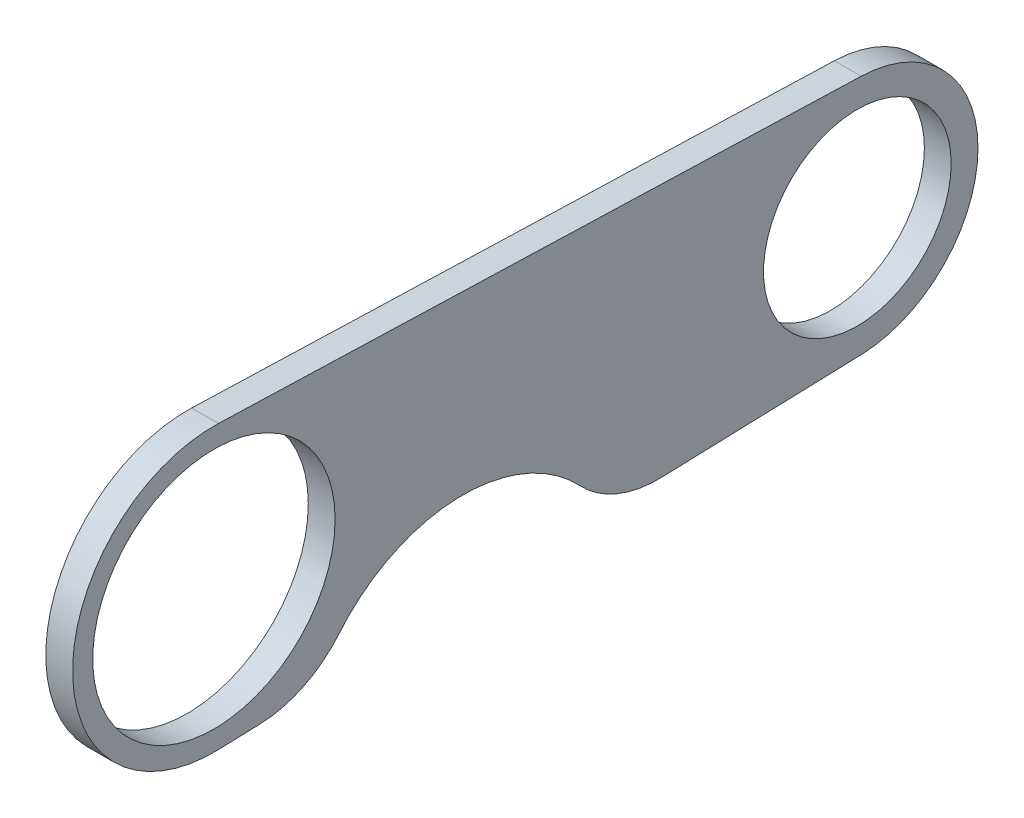
ISO-10303-21;
HEADER;
FILE_DESCRIPTION(('STEP AP214'),'2;1');
FILE_NAME('part.step','',(''),(''),'','','');
FILE_SCHEMA(('AUTOMOTIVE_DESIGN { 1 0 10303 214 1 1 1 1 }'));
ENDSEC;
DATA;
#1=APPLICATION_CONTEXT('core data for automotive mechanical design processes');
#2=APPLICATION_PROTOCOL_DEFINITION('international standard','automotive_design',2000,#1);
#3=PRODUCT_CONTEXT('',#1,'mechanical');
#4=PRODUCT('Part','Part','',(#3));
#5=PRODUCT_RELATED_PRODUCT_CATEGORY('part','',(#4));
#6=PRODUCT_DEFINITION_FORMATION('','',#4);
#7=PRODUCT_DEFINITION_CONTEXT('part definition',#1,'design');
#8=PRODUCT_DEFINITION('design','',#6,#7);
#9=PRODUCT_DEFINITION_SHAPE('','',#8);
#10=(LENGTH_UNIT() NAMED_UNIT(*) SI_UNIT(.MILLI.,.METRE.));
#11=(NAMED_UNIT(*) PLANE_ANGLE_UNIT() SI_UNIT($,.RADIAN.));
#12=(NAMED_UNIT(*) SI_UNIT($,.STERADIAN.) SOLID_ANGLE_UNIT());
#13=UNCERTAINTY_MEASURE_WITH_UNIT(LENGTH_MEASURE(1.E-05),#10,'distance_accuracy_value','');
#14=(GEOMETRIC_REPRESENTATION_CONTEXT(3) GLOBAL_UNCERTAINTY_ASSIGNED_CONTEXT((#13)) GLOBAL_UNIT_ASSIGNED_CONTEXT((#10,
#11,#12)) REPRESENTATION_CONTEXT('',''));
#15=CARTESIAN_POINT('',(0.,0.,0.));
#16=DIRECTION('',(0.,0.,1.));
#17=DIRECTION('',(1.,0.,0.));
#18=AXIS2_PLACEMENT_3D('',#15,#16,#17);
#19=CARTESIAN_POINT('',(3.175,-16.7236361933633,37.5631736458333));
#20=DIRECTION('',(0.,0.999485197350227,0.0320833333333336));
#21=DIRECTION('',(0.,-0.0320833333333336,0.999485197350227));
#22=AXIS2_PLACEMENT_3D('',#19,#20,#21);
#23=PLANE('',#22);
#24=DIRECTION('',(0.,0.0320833333333336,-0.999485197350227));
#25=VECTOR('',#24,1.);
#26=CARTESIAN_POINT('',(0.,-16.7236361933633,37.5631736458333));
#27=LINE('',#26,#25);
#28=CARTESIAN_POINT('',(0.,-16.7236361933633,37.5631736458333));
#29=VERTEX_POINT('',#28);
#30=CARTESIAN_POINT('',(0.,-16.5661067651328,32.6556931784006));
#31=VERTEX_POINT('',#30);
#32=EDGE_CURVE('E187',#29,#31,#27,.T.);
#33=ORIENTED_EDGE('',*,*,#32,.T.);
#34=DIRECTION('',(1.,0.,0.));
#35=VECTOR('',#34,1.);
#36=CARTESIAN_POINT('',(3.175,-16.5661067651328,32.6556931784006));
#37=LINE('',#36,#35);
#38=CARTESIAN_POINT('',(3.175,-16.5661067651328,32.6556931784006));
#39=VERTEX_POINT('',#38);
#40=EDGE_CURVE('E11',#31,#39,#37,.T.);
#41=ORIENTED_EDGE('',*,*,#40,.T.);
#42=DIRECTION('',(0.,0.0320833333333336,-0.999485197350227));
#43=VECTOR('',#42,1.);
#44=CARTESIAN_POINT('',(3.175,-16.7236361933633,37.5631736458333));
#45=LINE('',#44,#43);
#46=CARTESIAN_POINT('',(3.175,-16.7236361933633,37.5631736458333));
#47=VERTEX_POINT('',#46);
#48=EDGE_CURVE('E104',#47,#39,#45,.T.);
#49=ORIENTED_EDGE('',*,*,#48,.F.);
#50=DIRECTION('',(-1.,0.,0.));
#51=VECTOR('',#50,1.);
#52=CARTESIAN_POINT('',(3.175,-16.7236361933633,37.5631736458333));
#53=LINE('',#52,#51);
#54=EDGE_CURVE('E108',#47,#29,#53,.T.);
#55=ORIENTED_EDGE('',*,*,#54,.T.);
#56=EDGE_LOOP('',(#33,#41,#49,#55));
#57=FACE_BOUND('',#56,.T.);
#58=ADVANCED_FACE('F40',(#57),#23,.F.);
#59=CARTESIAN_POINT('',(3.175,0.,38.1));
#60=DIRECTION('',(1.,0.,0.));
#61=DIRECTION('',(0.,0.,-1.));
#62=AXIS2_PLACEMENT_3D('',#59,#60,#61);
#63=PLANE('',#62);
#64=CARTESIAN_POINT('',(3.175,-24.13,8.61520561374049));
#65=DIRECTION('',(1.,0.,0.));
#66=DIRECTION('',(0.,0.,-1.));
#67=AXIS2_PLACEMENT_3D('',#64,#65,#66);
#68=CIRCLE('',#67,19.05);
#69=CARTESIAN_POINT('',(3.175,-11.0598475480956,-5.24385694055871));
#70=VERTEX_POINT('',#69);
#71=CARTESIAN_POINT('',(3.175,-11.9755868552709,23.2839731525366));
#72=VERTEX_POINT('',#71);
#73=EDGE_CURVE('E148',#70,#72,#68,.T.);
#74=ORIENTED_EDGE('',*,*,#73,.F.);
#75=CARTESIAN_POINT('',(3.175,-2.34641258015939,-14.4832319767582));
#76=DIRECTION('',(1.,0.,0.));
#77=DIRECTION('',(0.,0.,-1.));
#78=AXIS2_PLACEMENT_3D('',#75,#76,#77);
#79=CIRCLE('',#78,12.7);
#80=CARTESIAN_POINT('',(3.175,-15.0398745865073,-14.8906903100915));
#81=VERTEX_POINT('',#80);
#82=EDGE_CURVE('E48',#70,#81,#79,.T.);
#83=ORIENTED_EDGE('',*,*,#82,.T.);
#84=CARTESIAN_POINT('',(3.175,-14.2801447571413,-38.558390625));
#85=VERTEX_POINT('',#84);
#86=EDGE_CURVE('E111',#81,#85,#45,.T.);
#87=ORIENTED_EDGE('',*,*,#86,.T.);
#88=CARTESIAN_POINT('',(3.175,0.,-38.1));
#89=DIRECTION('',(1.,0.,0.));
#90=DIRECTION('',(0.,0.,-1.));
#91=AXIS2_PLACEMENT_3D('',#88,#89,#90);
#92=CIRCLE('',#91,14.2875);
#93=CARTESIAN_POINT('',(3.175,14.2801447571414,-38.558390625));
#94=VERTEX_POINT('',#93);
#95=EDGE_CURVE('E110',#85,#94,#92,.T.);
#96=ORIENTED_EDGE('',*,*,#95,.T.);
#97=DIRECTION('',(0.,0.0320833333333331,0.999485197350227));
#98=VECTOR('',#97,1.);
#99=CARTESIAN_POINT('',(3.175,16.7236361933633,37.5631736458333));
#100=LINE('',#99,#98);
#101=CARTESIAN_POINT('',(3.175,16.7236361933633,37.5631736458333));
#102=VERTEX_POINT('',#101);
#103=EDGE_CURVE('E118',#94,#102,#100,.T.);
#104=ORIENTED_EDGE('',*,*,#103,.T.);
#105=CARTESIAN_POINT('',(3.175,0.,38.1));
#106=DIRECTION('',(1.,0.,0.));
#107=DIRECTION('',(0.,0.,-1.));
#108=AXIS2_PLACEMENT_3D('',#105,#106,#107);
#109=CIRCLE('',#108,16.73225);
#110=EDGE_CURVE('E114',#102,#47,#109,.T.);
#111=ORIENTED_EDGE('',*,*,#110,.T.);
#112=ORIENTED_EDGE('',*,*,#48,.T.);
#113=CARTESIAN_POINT('',(3.175,-3.87264475878492,33.063151511734));
#114=DIRECTION('',(1.,0.,0.));
#115=DIRECTION('',(0.,0.,-1.));
#116=AXIS2_PLACEMENT_3D('',#113,#114,#115);
#117=CIRCLE('',#116,12.7);
#118=EDGE_CURVE('E55',#39,#72,#117,.T.);
#119=ORIENTED_EDGE('',*,*,#118,.T.);
#120=EDGE_LOOP('',(#74,#83,#87,#96,#104,#111,#112,#119));
#121=FACE_BOUND('',#120,.T.);
#122=CARTESIAN_POINT('',(3.175,0.,38.1));
#123=DIRECTION('',(1.,0.,0.));
#124=DIRECTION('',(0.,0.,-1.));
#125=AXIS2_PLACEMENT_3D('',#122,#123,#124);
#126=CIRCLE('',#125,14.351);
#127=CARTESIAN_POINT('',(3.175,0.,23.749));
#128=VERTEX_POINT('',#127);
#129=EDGE_CURVE('E178',#128,#128,#126,.T.);
#130=ORIENTED_EDGE('',*,*,#129,.F.);
#131=EDGE_LOOP('',(#130));
#132=FACE_BOUND('',#131,.T.);
#133=CARTESIAN_POINT('',(3.175,0.,-38.1));
#134=DIRECTION('',(1.,0.,0.));
#135=DIRECTION('',(0.,0.,-1.));
#136=AXIS2_PLACEMENT_3D('',#133,#134,#135);
#137=CIRCLE('',#136,11.1125);
#138=CARTESIAN_POINT('',(3.175,0.,-49.2125));
#139=VERTEX_POINT('',#138);
#140=EDGE_CURVE('E171',#139,#139,#137,.T.);
#141=ORIENTED_EDGE('',*,*,#140,.F.);
#142=EDGE_LOOP('',(#141));
#143=FACE_BOUND('',#142,.T.);
#144=ADVANCED_FACE('F115',(#121,#132,#143),#63,.T.);
#145=CARTESIAN_POINT('',(0.,0.,38.1));
#146=DIRECTION('',(1.,0.,0.));
#147=DIRECTION('',(0.,0.,-1.));
#148=AXIS2_PLACEMENT_3D('',#145,#146,#147);
#149=PLANE('',#148);
#150=CARTESIAN_POINT('',(0.,-15.0398745865073,-14.8906903100915));
#151=VERTEX_POINT('',#150);
#152=CARTESIAN_POINT('',(0.,-14.2801447571413,-38.558390625));
#153=VERTEX_POINT('',#152);
#154=EDGE_CURVE('E165',#151,#153,#27,.T.);
#155=ORIENTED_EDGE('',*,*,#154,.F.);
#156=CARTESIAN_POINT('',(0.,-2.34641258015939,-14.4832319767582));
#157=DIRECTION('',(1.,0.,0.));
#158=DIRECTION('',(0.,0.,-1.));
#159=AXIS2_PLACEMENT_3D('',#156,#157,#158);
#160=CIRCLE('',#159,12.7);
#161=CARTESIAN_POINT('',(0.,-11.0598475480956,-5.24385694055871));
#162=VERTEX_POINT('',#161);
#163=EDGE_CURVE('E139',#151,#162,#160,.F.);
#164=ORIENTED_EDGE('',*,*,#163,.T.);
#165=CARTESIAN_POINT('',(0.,-24.13,8.61520561374049));
#166=DIRECTION('',(1.,0.,0.));
#167=DIRECTION('',(0.,0.,-1.));
#168=AXIS2_PLACEMENT_3D('',#165,#166,#167);
#169=CIRCLE('',#168,19.05);
#170=CARTESIAN_POINT('',(0.,-11.9755868552709,23.2839731525366));
#171=VERTEX_POINT('',#170);
#172=EDGE_CURVE('E162',#162,#171,#169,.T.);
#173=ORIENTED_EDGE('',*,*,#172,.T.);
#174=CARTESIAN_POINT('',(0.,-3.87264475878492,33.063151511734));
#175=DIRECTION('',(1.,0.,0.));
#176=DIRECTION('',(0.,0.,-1.));
#177=AXIS2_PLACEMENT_3D('',#174,#175,#176);
#178=CIRCLE('',#177,12.7);
#179=EDGE_CURVE('E131',#171,#31,#178,.F.);
#180=ORIENTED_EDGE('',*,*,#179,.T.);
#181=ORIENTED_EDGE('',*,*,#32,.F.);
#182=CARTESIAN_POINT('',(0.,0.,38.1));
#183=DIRECTION('',(1.,0.,0.));
#184=DIRECTION('',(0.,0.,-1.));
#185=AXIS2_PLACEMENT_3D('',#182,#183,#184);
#186=CIRCLE('',#185,16.73225);
#187=CARTESIAN_POINT('',(0.,16.7236361933633,37.5631736458333));
#188=VERTEX_POINT('',#187);
#189=EDGE_CURVE('E126',#188,#29,#186,.T.);
#190=ORIENTED_EDGE('',*,*,#189,.F.);
#191=DIRECTION('',(0.,0.0320833333333331,0.999485197350227));
#192=VECTOR('',#191,1.);
#193=CARTESIAN_POINT('',(0.,16.7236361933633,37.5631736458333));
#194=LINE('',#193,#192);
#195=CARTESIAN_POINT('',(0.,14.2801447571414,-38.558390625));
#196=VERTEX_POINT('',#195);
#197=EDGE_CURVE('E122',#196,#188,#194,.T.);
#198=ORIENTED_EDGE('',*,*,#197,.F.);
#199=CARTESIAN_POINT('',(0.,0.,-38.1));
#200=DIRECTION('',(1.,0.,0.));
#201=DIRECTION('',(0.,0.,-1.));
#202=AXIS2_PLACEMENT_3D('',#199,#200,#201);
#203=CIRCLE('',#202,14.2875);
#204=EDGE_CURVE('E189',#153,#196,#203,.T.);
#205=ORIENTED_EDGE('',*,*,#204,.F.);
#206=EDGE_LOOP('',(#155,#164,#173,#180,#181,#190,#198,#205));
#207=FACE_BOUND('',#206,.T.);
#208=CARTESIAN_POINT('',(0.,0.,38.1));
#209=DIRECTION('',(1.,0.,0.));
#210=DIRECTION('',(0.,0.,-1.));
#211=AXIS2_PLACEMENT_3D('',#208,#209,#210);
#212=CIRCLE('',#211,14.351);
#213=CARTESIAN_POINT('',(0.,0.,23.749));
#214=VERTEX_POINT('',#213);
#215=EDGE_CURVE('E176',#214,#214,#212,.T.);
#216=ORIENTED_EDGE('',*,*,#215,.T.);
#217=EDGE_LOOP('',(#216));
#218=FACE_BOUND('',#217,.T.);
#219=CARTESIAN_POINT('',(0.,0.,-38.1));
#220=DIRECTION('',(1.,0.,0.));
#221=DIRECTION('',(0.,0.,-1.));
#222=AXIS2_PLACEMENT_3D('',#219,#220,#221);
#223=CIRCLE('',#222,11.1125);
#224=CARTESIAN_POINT('',(0.,0.,-49.2125));
#225=VERTEX_POINT('',#224);
#226=EDGE_CURVE('E168',#225,#225,#223,.T.);
#227=ORIENTED_EDGE('',*,*,#226,.T.);
#228=EDGE_LOOP('',(#227));
#229=FACE_BOUND('',#228,.T.);
#230=ADVANCED_FACE('F160',(#207,#218,#229),#149,.F.);
#231=CARTESIAN_POINT('',(3.175,0.,38.1));
#232=DIRECTION('',(-1.,0.,0.));
#233=DIRECTION('',(0.,0.,1.));
#234=AXIS2_PLACEMENT_3D('',#231,#232,#233);
#235=CYLINDRICAL_SURFACE('',#234,16.73225);
#236=ORIENTED_EDGE('',*,*,#189,.T.);
#237=ORIENTED_EDGE('',*,*,#54,.F.);
#238=ORIENTED_EDGE('',*,*,#110,.F.);
#239=DIRECTION('',(-1.,0.,0.));
#240=VECTOR('',#239,1.);
#241=CARTESIAN_POINT('',(3.175,16.7236361933633,37.5631736458333));
#242=LINE('',#241,#240);
#243=EDGE_CURVE('E185',#102,#188,#242,.T.);
#244=ORIENTED_EDGE('',*,*,#243,.T.);
#245=EDGE_LOOP('',(#236,#237,#238,#244));
#246=FACE_BOUND('',#245,.T.);
#247=ADVANCED_FACE('F124',(#246),#235,.T.);
#248=ORIENTED_EDGE('',*,*,#86,.F.);
#249=DIRECTION('',(1.,0.,0.));
#250=VECTOR('',#249,1.);
#251=CARTESIAN_POINT('',(3.175,-15.0398745865073,-14.8906903100915));
#252=LINE('',#251,#250);
#253=EDGE_CURVE('E127',#81,#151,#252,.F.);
#254=ORIENTED_EDGE('',*,*,#253,.T.);
#255=ORIENTED_EDGE('',*,*,#154,.T.);
#256=DIRECTION('',(-1.,0.,0.));
#257=VECTOR('',#256,1.);
#258=CARTESIAN_POINT('',(3.175,-14.2801447571413,-38.558390625));
#259=LINE('',#258,#257);
#260=EDGE_CURVE('E128',#85,#153,#259,.T.);
#261=ORIENTED_EDGE('',*,*,#260,.F.);
#262=EDGE_LOOP('',(#248,#254,#255,#261));
#263=FACE_BOUND('',#262,.T.);
#264=ADVANCED_FACE('F153',(#263),#23,.F.);
#265=CARTESIAN_POINT('',(3.175,0.,-38.1));
#266=DIRECTION('',(-1.,0.,0.));
#267=DIRECTION('',(0.,0.,1.));
#268=AXIS2_PLACEMENT_3D('',#265,#266,#267);
#269=CYLINDRICAL_SURFACE('',#268,14.2875);
#270=ORIENTED_EDGE('',*,*,#204,.T.);
#271=DIRECTION('',(-1.,0.,0.));
#272=VECTOR('',#271,1.);
#273=CARTESIAN_POINT('',(3.175,14.2801447571414,-38.558390625));
#274=LINE('',#273,#272);
#275=EDGE_CURVE('E134',#94,#196,#274,.T.);
#276=ORIENTED_EDGE('',*,*,#275,.F.);
#277=ORIENTED_EDGE('',*,*,#95,.F.);
#278=ORIENTED_EDGE('',*,*,#260,.T.);
#279=EDGE_LOOP('',(#270,#276,#277,#278));
#280=FACE_BOUND('',#279,.T.);
#281=ADVANCED_FACE('F211',(#280),#269,.T.);
#282=CARTESIAN_POINT('',(3.175,16.7236361933633,37.5631736458333));
#283=DIRECTION('',(0.,-0.999485197350227,0.0320833333333331));
#284=DIRECTION('',(0.,-0.0320833333333332,-0.999485197350227));
#285=AXIS2_PLACEMENT_3D('',#282,#283,#284);
#286=PLANE('',#285);
#287=ORIENTED_EDGE('',*,*,#197,.T.);
#288=ORIENTED_EDGE('',*,*,#243,.F.);
#289=ORIENTED_EDGE('',*,*,#103,.F.);
#290=ORIENTED_EDGE('',*,*,#275,.T.);
#291=EDGE_LOOP('',(#287,#288,#289,#290));
#292=FACE_BOUND('',#291,.T.);
#293=ADVANCED_FACE('F196',(#292),#286,.F.);
#294=CARTESIAN_POINT('',(3.175,0.,38.1));
#295=DIRECTION('',(-1.,0.,0.));
#296=DIRECTION('',(0.,0.,1.));
#297=AXIS2_PLACEMENT_3D('',#294,#295,#296);
#298=CYLINDRICAL_SURFACE('',#297,14.351);
#299=ORIENTED_EDGE('',*,*,#129,.T.);
#300=EDGE_LOOP('',(#299));
#301=FACE_BOUND('',#300,.T.);
#302=ORIENTED_EDGE('',*,*,#215,.F.);
#303=EDGE_LOOP('',(#302));
#304=FACE_BOUND('',#303,.T.);
#305=ADVANCED_FACE('F225',(#301,#304),#298,.F.);
#306=CARTESIAN_POINT('',(3.175,0.,-38.1));
#307=DIRECTION('',(-1.,0.,0.));
#308=DIRECTION('',(0.,0.,1.));
#309=AXIS2_PLACEMENT_3D('',#306,#307,#308);
#310=CYLINDRICAL_SURFACE('',#309,11.1125);
#311=ORIENTED_EDGE('',*,*,#140,.T.);
#312=EDGE_LOOP('',(#311));
#313=FACE_BOUND('',#312,.T.);
#314=ORIENTED_EDGE('',*,*,#226,.F.);
#315=EDGE_LOOP('',(#314));
#316=FACE_BOUND('',#315,.T.);
#317=ADVANCED_FACE('F229',(#313,#316),#310,.F.);
#318=CARTESIAN_POINT('',(0.,-24.13,8.61520561374049));
#319=DIRECTION('',(1.,0.,0.));
#320=DIRECTION('',(0.,0.,-1.));
#321=AXIS2_PLACEMENT_3D('',#318,#319,#320);
#322=CYLINDRICAL_SURFACE('',#321,19.05);
#323=ORIENTED_EDGE('',*,*,#172,.F.);
#324=DIRECTION('',(1.,0.,0.));
#325=VECTOR('',#324,1.);
#326=CARTESIAN_POINT('',(0.,-11.0598475480956,-5.24385694055871));
#327=LINE('',#326,#325);
#328=EDGE_CURVE('E143',#162,#70,#327,.T.);
#329=ORIENTED_EDGE('',*,*,#328,.T.);
#330=ORIENTED_EDGE('',*,*,#73,.T.);
#331=DIRECTION('',(1.,0.,0.));
#332=VECTOR('',#331,1.);
#333=CARTESIAN_POINT('',(0.,-11.9755868552709,23.2839731525366));
#334=LINE('',#333,#332);
#335=EDGE_CURVE('E141',#72,#171,#334,.F.);
#336=ORIENTED_EDGE('',*,*,#335,.T.);
#337=EDGE_LOOP('',(#323,#329,#330,#336));
#338=FACE_BOUND('',#337,.T.);
#339=ADVANCED_FACE('F167',(#338),#322,.F.);
#340=CARTESIAN_POINT('',(0.,-2.34641258015939,-14.4832319767582));
#341=DIRECTION('',(1.,0.,0.));
#342=DIRECTION('',(0.,0.,-1.));
#343=AXIS2_PLACEMENT_3D('',#340,#341,#342);
#344=CYLINDRICAL_SURFACE('',#343,12.7);
#345=ORIENTED_EDGE('',*,*,#82,.F.);
#346=ORIENTED_EDGE('',*,*,#328,.F.);
#347=ORIENTED_EDGE('',*,*,#163,.F.);
#348=ORIENTED_EDGE('',*,*,#253,.F.);
#349=EDGE_LOOP('',(#345,#346,#347,#348));
#350=FACE_BOUND('',#349,.T.);
#351=ADVANCED_FACE('F156',(#350),#344,.T.);
#352=CARTESIAN_POINT('',(0.,-3.87264475878492,33.063151511734));
#353=DIRECTION('',(1.,0.,0.));
#354=DIRECTION('',(0.,0.,-1.));
#355=AXIS2_PLACEMENT_3D('',#352,#353,#354);
#356=CYLINDRICAL_SURFACE('',#355,12.7);
#357=ORIENTED_EDGE('',*,*,#179,.F.);
#358=ORIENTED_EDGE('',*,*,#335,.F.);
#359=ORIENTED_EDGE('',*,*,#118,.F.);
#360=ORIENTED_EDGE('',*,*,#40,.F.);
#361=EDGE_LOOP('',(#357,#358,#359,#360));
#362=FACE_BOUND('',#361,.T.);
#363=ADVANCED_FACE('F42',(#362),#356,.T.);
#364=CLOSED_SHELL('',(#58,#144,#230,#247,#264,#281,#293,#305,#317,#339,#351,#363));
#365=MANIFOLD_SOLID_BREP('B2',#364);
#366=ADVANCED_BREP_SHAPE_REPRESENTATION('',(#18,#365),#14);
#367=SHAPE_DEFINITION_REPRESENTATION(#9,#366);
ENDSEC;
END-ISO-10303-21;
